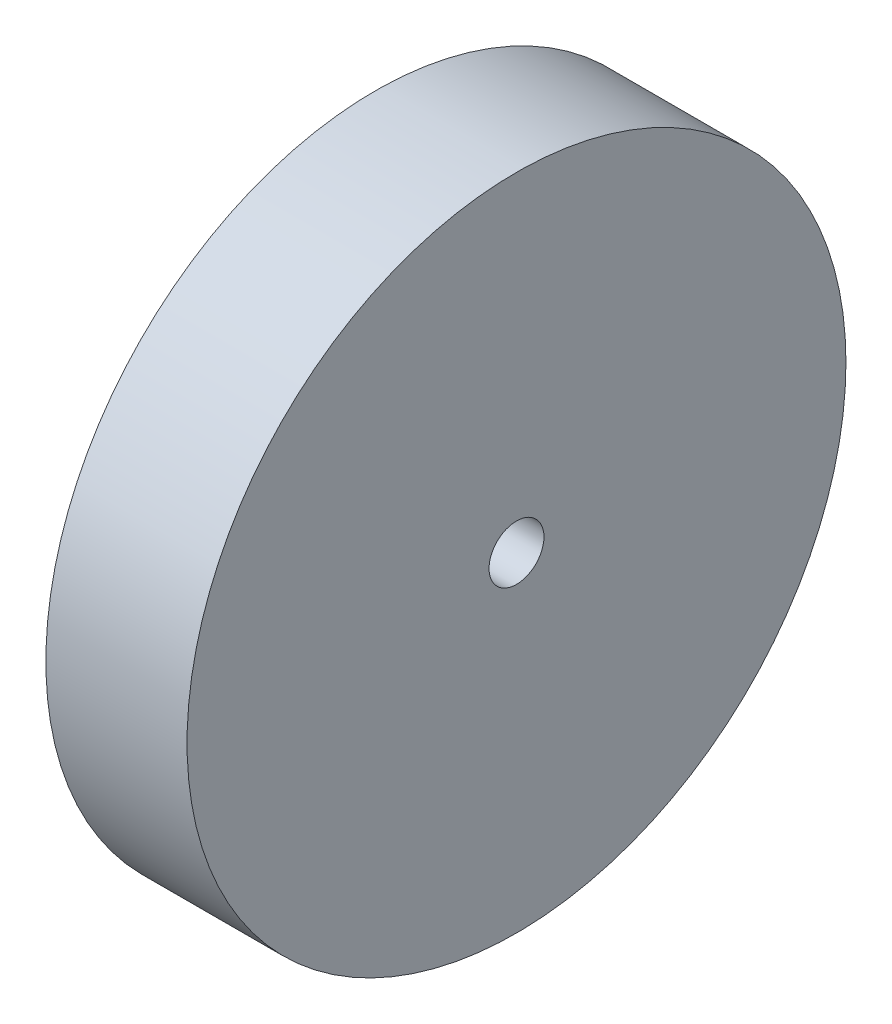
ISO-10303-21;
HEADER;
FILE_DESCRIPTION(('STEP AP214'),'2;1');
FILE_NAME('part.step','',(''),(''),'','','');
FILE_SCHEMA(('AUTOMOTIVE_DESIGN { 1 0 10303 214 1 1 1 1 }'));
ENDSEC;
DATA;
#1=APPLICATION_CONTEXT('core data for automotive mechanical design processes');
#2=APPLICATION_PROTOCOL_DEFINITION('international standard','automotive_design',2000,#1);
#3=PRODUCT_CONTEXT('',#1,'mechanical');
#4=PRODUCT('Part','Part','',(#3));
#5=PRODUCT_RELATED_PRODUCT_CATEGORY('part','',(#4));
#6=PRODUCT_DEFINITION_FORMATION('','',#4);
#7=PRODUCT_DEFINITION_CONTEXT('part definition',#1,'design');
#8=PRODUCT_DEFINITION('design','',#6,#7);
#9=PRODUCT_DEFINITION_SHAPE('','',#8);
#10=(LENGTH_UNIT() NAMED_UNIT(*) SI_UNIT(.MILLI.,.METRE.));
#11=(NAMED_UNIT(*) PLANE_ANGLE_UNIT() SI_UNIT($,.RADIAN.));
#12=(NAMED_UNIT(*) SI_UNIT($,.STERADIAN.) SOLID_ANGLE_UNIT());
#13=UNCERTAINTY_MEASURE_WITH_UNIT(LENGTH_MEASURE(1.E-05),#10,'distance_accuracy_value','');
#14=(GEOMETRIC_REPRESENTATION_CONTEXT(3) GLOBAL_UNCERTAINTY_ASSIGNED_CONTEXT((#13)) GLOBAL_UNIT_ASSIGNED_CONTEXT((#10,
#11,#12)) REPRESENTATION_CONTEXT('',''));
#15=CARTESIAN_POINT('',(0.,0.,0.));
#16=DIRECTION('',(0.,0.,1.));
#17=DIRECTION('',(1.,0.,0.));
#18=AXIS2_PLACEMENT_3D('',#15,#16,#17);
#19=CARTESIAN_POINT('',(15.,0.,0.));
#20=DIRECTION('',(1.,0.,0.));
#21=DIRECTION('',(0.,0.,-1.));
#22=AXIS2_PLACEMENT_3D('',#19,#20,#21);
#23=PLANE('',#22);
#24=CARTESIAN_POINT('',(15.,0.,0.));
#25=DIRECTION('',(1.,0.,0.));
#26=DIRECTION('',(0.,0.,-1.));
#27=AXIS2_PLACEMENT_3D('',#24,#25,#26);
#28=CIRCLE('',#27,35.);
#29=CARTESIAN_POINT('',(15.,0.,-35.));
#30=VERTEX_POINT('',#29);
#31=EDGE_CURVE('E10',#30,#30,#28,.T.);
#32=ORIENTED_EDGE('',*,*,#31,.T.);
#33=EDGE_LOOP('',(#32));
#34=FACE_BOUND('',#33,.T.);
#35=CARTESIAN_POINT('',(15.,0.,0.));
#36=DIRECTION('',(1.,0.,0.));
#37=DIRECTION('',(0.,0.,-1.));
#38=AXIS2_PLACEMENT_3D('',#35,#36,#37);
#39=CIRCLE('',#38,2.91666666666667);
#40=CARTESIAN_POINT('',(15.,0.,-2.91666666666667));
#41=VERTEX_POINT('',#40);
#42=EDGE_CURVE('E42',#41,#41,#39,.T.);
#43=ORIENTED_EDGE('',*,*,#42,.F.);
#44=EDGE_LOOP('',(#43));
#45=FACE_BOUND('',#44,.T.);
#46=ADVANCED_FACE('F31',(#34,#45),#23,.T.);
#47=CARTESIAN_POINT('',(0.,0.,0.));
#48=DIRECTION('',(1.,0.,0.));
#49=DIRECTION('',(0.,0.,-1.));
#50=AXIS2_PLACEMENT_3D('',#47,#48,#49);
#51=PLANE('',#50);
#52=CARTESIAN_POINT('',(0.,0.,0.));
#53=DIRECTION('',(1.,0.,0.));
#54=DIRECTION('',(0.,0.,-1.));
#55=AXIS2_PLACEMENT_3D('',#52,#53,#54);
#56=CIRCLE('',#55,35.);
#57=CARTESIAN_POINT('',(0.,0.,-35.));
#58=VERTEX_POINT('',#57);
#59=EDGE_CURVE('E35',#58,#58,#56,.T.);
#60=ORIENTED_EDGE('',*,*,#59,.F.);
#61=EDGE_LOOP('',(#60));
#62=FACE_BOUND('',#61,.T.);
#63=CARTESIAN_POINT('',(0.,0.,0.));
#64=DIRECTION('',(1.,0.,0.));
#65=DIRECTION('',(0.,0.,-1.));
#66=AXIS2_PLACEMENT_3D('',#63,#64,#65);
#67=CIRCLE('',#66,2.91666666666667);
#68=CARTESIAN_POINT('',(0.,0.,-2.91666666666667));
#69=VERTEX_POINT('',#68);
#70=EDGE_CURVE('E44',#69,#69,#67,.T.);
#71=ORIENTED_EDGE('',*,*,#70,.T.);
#72=EDGE_LOOP('',(#71));
#73=FACE_BOUND('',#72,.T.);
#74=ADVANCED_FACE('F54',(#62,#73),#51,.F.);
#75=CARTESIAN_POINT('',(15.,0.,0.));
#76=DIRECTION('',(-1.,0.,0.));
#77=DIRECTION('',(0.,0.,1.));
#78=AXIS2_PLACEMENT_3D('',#75,#76,#77);
#79=CYLINDRICAL_SURFACE('',#78,35.);
#80=ORIENTED_EDGE('',*,*,#31,.F.);
#81=EDGE_LOOP('',(#80));
#82=FACE_BOUND('',#81,.T.);
#83=ORIENTED_EDGE('',*,*,#59,.T.);
#84=EDGE_LOOP('',(#83));
#85=FACE_BOUND('',#84,.T.);
#86=ADVANCED_FACE('F33',(#82,#85),#79,.T.);
#87=CARTESIAN_POINT('',(15.,0.,0.));
#88=DIRECTION('',(-1.,0.,0.));
#89=DIRECTION('',(0.,0.,1.));
#90=AXIS2_PLACEMENT_3D('',#87,#88,#89);
#91=CYLINDRICAL_SURFACE('',#90,2.91666666666667);
#92=ORIENTED_EDGE('',*,*,#42,.T.);
#93=EDGE_LOOP('',(#92));
#94=FACE_BOUND('',#93,.T.);
#95=ORIENTED_EDGE('',*,*,#70,.F.);
#96=EDGE_LOOP('',(#95));
#97=FACE_BOUND('',#96,.T.);
#98=ADVANCED_FACE('F50',(#94,#97),#91,.F.);
#99=CLOSED_SHELL('',(#46,#74,#86,#98));
#100=MANIFOLD_SOLID_BREP('B2',#99);
#101=ADVANCED_BREP_SHAPE_REPRESENTATION('',(#18,#100),#14);
#102=SHAPE_DEFINITION_REPRESENTATION(#9,#101);
ENDSEC;
END-ISO-10303-21;
